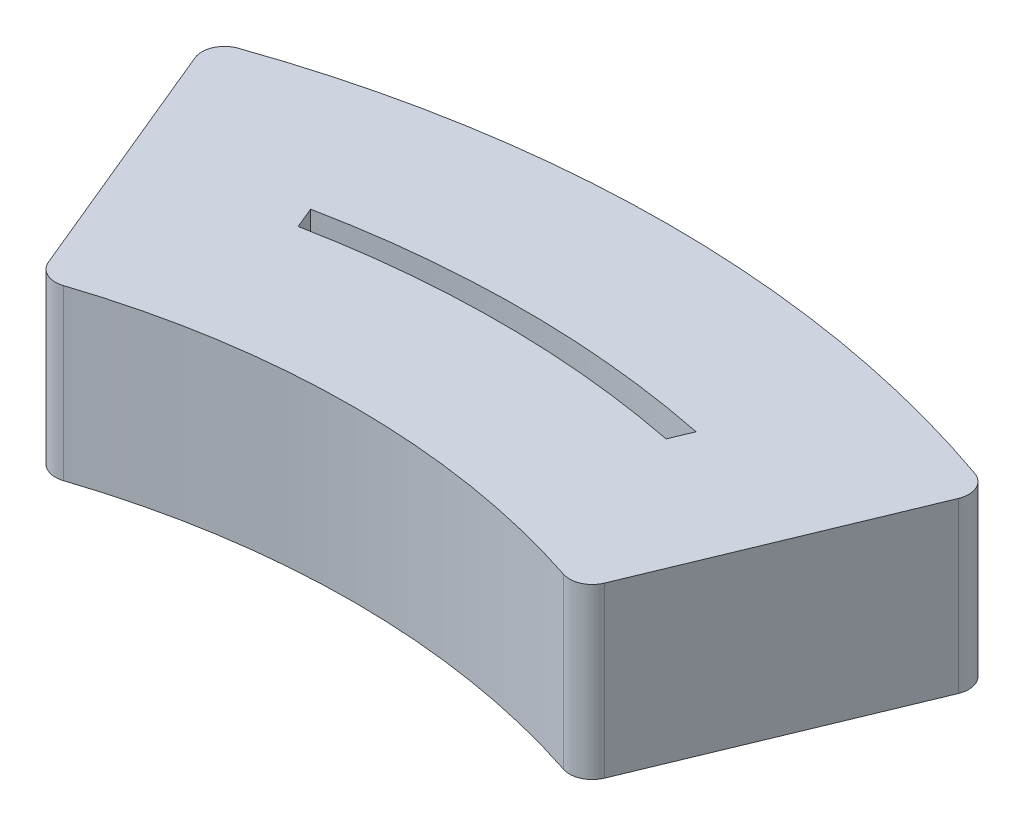
ISO-10303-21;
HEADER;
FILE_DESCRIPTION(('STEP AP214'),'2;1');
FILE_NAME('part.step','',(''),(''),'','','');
FILE_SCHEMA(('AUTOMOTIVE_DESIGN { 1 0 10303 214 1 1 1 1 }'));
ENDSEC;
DATA;
#1=APPLICATION_CONTEXT('core data for automotive mechanical design processes');
#2=APPLICATION_PROTOCOL_DEFINITION('international standard','automotive_design',2000,#1);
#3=PRODUCT_CONTEXT('',#1,'mechanical');
#4=PRODUCT('Part','Part','',(#3));
#5=PRODUCT_RELATED_PRODUCT_CATEGORY('part','',(#4));
#6=PRODUCT_DEFINITION_FORMATION('','',#4);
#7=PRODUCT_DEFINITION_CONTEXT('part definition',#1,'design');
#8=PRODUCT_DEFINITION('design','',#6,#7);
#9=PRODUCT_DEFINITION_SHAPE('','',#8);
#10=(LENGTH_UNIT() NAMED_UNIT(*) SI_UNIT(.MILLI.,.METRE.));
#11=(NAMED_UNIT(*) PLANE_ANGLE_UNIT() SI_UNIT($,.RADIAN.));
#12=(NAMED_UNIT(*) SI_UNIT($,.STERADIAN.) SOLID_ANGLE_UNIT());
#13=UNCERTAINTY_MEASURE_WITH_UNIT(LENGTH_MEASURE(1.E-05),#10,'distance_accuracy_value','');
#14=(GEOMETRIC_REPRESENTATION_CONTEXT(3) GLOBAL_UNCERTAINTY_ASSIGNED_CONTEXT((#13)) GLOBAL_UNIT_ASSIGNED_CONTEXT((#10,
#11,#12)) REPRESENTATION_CONTEXT('',''));
#15=CARTESIAN_POINT('',(0.,0.,0.));
#16=DIRECTION('',(0.,0.,1.));
#17=DIRECTION('',(1.,0.,0.));
#18=AXIS2_PLACEMENT_3D('',#15,#16,#17);
#19=CARTESIAN_POINT('',(160.369594431657,37.5,-44.0759031903086));
#20=DIRECTION('',(0.,-1.,0.));
#21=DIRECTION('',(0.,0.,-1.));
#22=AXIS2_PLACEMENT_3D('',#19,#20,#21);
#23=PLANE('',#22);
#24=CARTESIAN_POINT('',(160.369594431657,37.5,-44.0759031903086));
#25=DIRECTION('',(0.,1.,0.));
#26=DIRECTION('',(0.,0.,-1.));
#27=AXIS2_PLACEMENT_3D('',#24,#25,#26);
#28=CIRCLE('',#27,10.);
#29=CARTESIAN_POINT('',(169.60838975677,37.5,-40.2490688666577));
#30=VERTEX_POINT('',#29);
#31=CARTESIAN_POINT('',(163.671991071137,37.5,-53.5148743437529));
#32=VERTEX_POINT('',#31);
#33=EDGE_CURVE('E158',#30,#32,#28,.T.);
#34=ORIENTED_EDGE('',*,*,#33,.T.);
#35=CARTESIAN_POINT('',(0.203357416899197,37.5,413.714197751741));
#36=DIRECTION('',(0.,1.,0.));
#37=DIRECTION('',(0.,0.,1.));
#38=AXIS2_PLACEMENT_3D('',#35,#36,#37);
#39=CIRCLE('',#38,495.);
#40=CARTESIAN_POINT('',(-163.265276237338,37.5,-53.5148743437529));
#41=VERTEX_POINT('',#40);
#42=EDGE_CURVE('E161',#32,#41,#39,.T.);
#43=ORIENTED_EDGE('',*,*,#42,.T.);
#44=CARTESIAN_POINT('',(-159.962879597859,37.5,-44.0759031903086));
#45=DIRECTION('',(0.,1.,0.));
#46=DIRECTION('',(0.,0.,-1.));
#47=AXIS2_PLACEMENT_3D('',#44,#45,#46);
#48=CIRCLE('',#47,10.);
#49=CARTESIAN_POINT('',(-169.201674922972,37.5,-40.2490688666577));
#50=VERTEX_POINT('',#49);
#51=EDGE_CURVE('E164',#41,#50,#48,.T.);
#52=ORIENTED_EDGE('',*,*,#51,.T.);
#53=DIRECTION('',(0.382683432365087,0.,0.923879532511288));
#54=VECTOR('',#53,1.);
#55=CARTESIAN_POINT('',(-169.201674922972,37.5,-40.2490688666577));
#56=LINE('',#55,#54);
#57=CARTESIAN_POINT('',(-123.183289960131,37.5,70.8491402291399));
#58=VERTEX_POINT('',#57);
#59=EDGE_CURVE('E166',#50,#58,#56,.T.);
#60=ORIENTED_EDGE('',*,*,#59,.T.);
#61=CARTESIAN_POINT('',(-113.944494635018,37.5,67.022305905489));
#62=DIRECTION('',(0.,1.,0.));
#63=DIRECTION('',(0.,0.,1.));
#64=AXIS2_PLACEMENT_3D('',#61,#62,#63);
#65=CIRCLE('',#64,10.);
#66=CARTESIAN_POINT('',(-110.817156222636,37.5,76.5207139012768));
#67=VERTEX_POINT('',#66);
#68=EDGE_CURVE('E168',#58,#67,#65,.T.);
#69=ORIENTED_EDGE('',*,*,#68,.T.);
#70=CARTESIAN_POINT('',(0.203357416899197,37.5,413.714197751741));
#71=DIRECTION('',(0.,-1.,0.));
#72=DIRECTION('',(0.,0.,-1.));
#73=AXIS2_PLACEMENT_3D('',#70,#71,#72);
#74=CIRCLE('',#73,355.);
#75=CARTESIAN_POINT('',(111.223871056435,37.5,76.5207139012768));
#76=VERTEX_POINT('',#75);
#77=EDGE_CURVE('E170',#67,#76,#74,.T.);
#78=ORIENTED_EDGE('',*,*,#77,.T.);
#79=CARTESIAN_POINT('',(114.351209468816,37.5,67.022305905489));
#80=DIRECTION('',(0.,1.,0.));
#81=DIRECTION('',(0.,0.,-1.));
#82=AXIS2_PLACEMENT_3D('',#79,#80,#81);
#83=CIRCLE('',#82,10.);
#84=CARTESIAN_POINT('',(123.590004793929,37.5,70.8491402291399));
#85=VERTEX_POINT('',#84);
#86=EDGE_CURVE('E172',#76,#85,#83,.T.);
#87=ORIENTED_EDGE('',*,*,#86,.T.);
#88=DIRECTION('',(0.382683432365087,0.,-0.923879532511288));
#89=VECTOR('',#88,1.);
#90=CARTESIAN_POINT('',(123.590004793929,37.5,70.8491402291399));
#91=LINE('',#90,#89);
#92=EDGE_CURVE('E174',#85,#30,#91,.T.);
#93=ORIENTED_EDGE('',*,*,#92,.T.);
#94=EDGE_LOOP('',(#34,#43,#52,#60,#69,#78,#87,#93));
#95=FACE_BOUND('',#94,.T.);
#96=DIRECTION('',(0.382683432365087,0.,-0.923879532511288));
#97=VECTOR('',#96,1.);
#98=CARTESIAN_POINT('',(81.8648120493621,37.5,1.72948101177539));
#99=LINE('',#98,#97);
#100=CARTESIAN_POINT('',(81.8648120493621,37.5,1.72948101177539));
#101=VERTEX_POINT('',#100);
#102=CARTESIAN_POINT('',(85.7653340171303,37.5,-7.68721202314482));
#103=VERTEX_POINT('',#102);
#104=EDGE_CURVE('E122',#101,#103,#99,.T.);
#105=ORIENTED_EDGE('',*,*,#104,.F.);
#106=CARTESIAN_POINT('',(0.203357416899197,37.5,413.714197751741));
#107=DIRECTION('',(0.,-1.,0.));
#108=DIRECTION('',(0.,0.,-1.));
#109=AXIS2_PLACEMENT_3D('',#106,#107,#108);
#110=CIRCLE('',#109,420.);
#111=CARTESIAN_POINT('',(-81.4580972155637,37.5,1.72948101177539));
#112=VERTEX_POINT('',#111);
#113=EDGE_CURVE('E144',#112,#101,#110,.T.);
#114=ORIENTED_EDGE('',*,*,#113,.F.);
#115=DIRECTION('',(0.382683432365088,0.,0.923879532511288));
#116=VECTOR('',#115,1.);
#117=CARTESIAN_POINT('',(-85.3586191833319,37.5,-7.68721202314482));
#118=LINE('',#117,#116);
#119=CARTESIAN_POINT('',(-85.3586191833318,37.5,-7.68721202314482));
#120=VERTEX_POINT('',#119);
#121=EDGE_CURVE('E142',#120,#112,#118,.T.);
#122=ORIENTED_EDGE('',*,*,#121,.F.);
#123=CARTESIAN_POINT('',(0.203357416899197,37.5,413.714197751741));
#124=DIRECTION('',(0.,1.,0.));
#125=DIRECTION('',(0.,0.,1.));
#126=AXIS2_PLACEMENT_3D('',#123,#124,#125);
#127=CIRCLE('',#126,430.);
#128=EDGE_CURVE('E130',#103,#120,#127,.T.);
#129=ORIENTED_EDGE('',*,*,#128,.F.);
#130=EDGE_LOOP('',(#105,#114,#122,#129));
#131=FACE_BOUND('',#130,.T.);
#132=ADVANCED_FACE('F33',(#95,#131),#23,.F.);
#133=CARTESIAN_POINT('',(160.369594431657,-37.5,-44.0759031903086));
#134=DIRECTION('',(0.,-1.,0.));
#135=DIRECTION('',(0.,0.,-1.));
#136=AXIS2_PLACEMENT_3D('',#133,#134,#135);
#137=PLANE('',#136);
#138=CARTESIAN_POINT('',(160.369594431657,-37.5,-44.0759031903086));
#139=DIRECTION('',(0.,1.,0.));
#140=DIRECTION('',(0.,0.,-1.));
#141=AXIS2_PLACEMENT_3D('',#138,#139,#140);
#142=CIRCLE('',#141,10.);
#143=CARTESIAN_POINT('',(169.60838975677,-37.5,-40.2490688666577));
#144=VERTEX_POINT('',#143);
#145=CARTESIAN_POINT('',(163.671991071137,-37.5,-53.5148743437529));
#146=VERTEX_POINT('',#145);
#147=EDGE_CURVE('E138',#144,#146,#142,.T.);
#148=ORIENTED_EDGE('',*,*,#147,.F.);
#149=DIRECTION('',(0.382683432365087,0.,-0.923879532511288));
#150=VECTOR('',#149,1.);
#151=CARTESIAN_POINT('',(123.590004793929,-37.5,70.8491402291399));
#152=LINE('',#151,#150);
#153=CARTESIAN_POINT('',(123.590004793929,-37.5,70.8491402291399));
#154=VERTEX_POINT('',#153);
#155=EDGE_CURVE('E162',#154,#144,#152,.T.);
#156=ORIENTED_EDGE('',*,*,#155,.F.);
#157=CARTESIAN_POINT('',(114.351209468816,-37.5,67.022305905489));
#158=DIRECTION('',(0.,1.,0.));
#159=DIRECTION('',(0.,0.,-1.));
#160=AXIS2_PLACEMENT_3D('',#157,#158,#159);
#161=CIRCLE('',#160,10.);
#162=CARTESIAN_POINT('',(111.223871056435,-37.5,76.5207139012768));
#163=VERTEX_POINT('',#162);
#164=EDGE_CURVE('E189',#163,#154,#161,.T.);
#165=ORIENTED_EDGE('',*,*,#164,.F.);
#166=CARTESIAN_POINT('',(0.203357416899197,-37.5,413.714197751741));
#167=DIRECTION('',(0.,-1.,0.));
#168=DIRECTION('',(0.,0.,-1.));
#169=AXIS2_PLACEMENT_3D('',#166,#167,#168);
#170=CIRCLE('',#169,355.);
#171=CARTESIAN_POINT('',(-110.817156222636,-37.5,76.5207139012768));
#172=VERTEX_POINT('',#171);
#173=EDGE_CURVE('E187',#172,#163,#170,.T.);
#174=ORIENTED_EDGE('',*,*,#173,.F.);
#175=CARTESIAN_POINT('',(-113.944494635018,-37.5,67.022305905489));
#176=DIRECTION('',(0.,1.,0.));
#177=DIRECTION('',(0.,0.,1.));
#178=AXIS2_PLACEMENT_3D('',#175,#176,#177);
#179=CIRCLE('',#178,10.);
#180=CARTESIAN_POINT('',(-123.183289960131,-37.5,70.8491402291399));
#181=VERTEX_POINT('',#180);
#182=EDGE_CURVE('E185',#181,#172,#179,.T.);
#183=ORIENTED_EDGE('',*,*,#182,.F.);
#184=DIRECTION('',(0.382683432365087,0.,0.923879532511288));
#185=VECTOR('',#184,1.);
#186=CARTESIAN_POINT('',(-169.201674922972,-37.5,-40.2490688666577));
#187=LINE('',#186,#185);
#188=CARTESIAN_POINT('',(-169.201674922972,-37.5,-40.2490688666577));
#189=VERTEX_POINT('',#188);
#190=EDGE_CURVE('E183',#189,#181,#187,.T.);
#191=ORIENTED_EDGE('',*,*,#190,.F.);
#192=CARTESIAN_POINT('',(-159.962879597859,-37.5,-44.0759031903086));
#193=DIRECTION('',(0.,1.,0.));
#194=DIRECTION('',(0.,0.,-1.));
#195=AXIS2_PLACEMENT_3D('',#192,#193,#194);
#196=CIRCLE('',#195,10.);
#197=CARTESIAN_POINT('',(-163.265276237338,-37.5,-53.5148743437529));
#198=VERTEX_POINT('',#197);
#199=EDGE_CURVE('E181',#198,#189,#196,.T.);
#200=ORIENTED_EDGE('',*,*,#199,.F.);
#201=CARTESIAN_POINT('',(0.203357416899197,-37.5,413.714197751741));
#202=DIRECTION('',(0.,1.,0.));
#203=DIRECTION('',(0.,0.,1.));
#204=AXIS2_PLACEMENT_3D('',#201,#202,#203);
#205=CIRCLE('',#204,495.);
#206=EDGE_CURVE('E179',#146,#198,#205,.T.);
#207=ORIENTED_EDGE('',*,*,#206,.F.);
#208=EDGE_LOOP('',(#148,#156,#165,#174,#183,#191,#200,#207));
#209=FACE_BOUND('',#208,.T.);
#210=CARTESIAN_POINT('',(0.203357416899197,-37.5,413.714197751741));
#211=DIRECTION('',(0.,-1.,0.));
#212=DIRECTION('',(0.,0.,-1.));
#213=AXIS2_PLACEMENT_3D('',#210,#211,#212);
#214=CIRCLE('',#213,420.);
#215=CARTESIAN_POINT('',(-81.4580972155637,-37.5,1.72948101177539));
#216=VERTEX_POINT('',#215);
#217=CARTESIAN_POINT('',(81.8648120493621,-37.5,1.72948101177539));
#218=VERTEX_POINT('',#217);
#219=EDGE_CURVE('E131',#216,#218,#214,.T.);
#220=ORIENTED_EDGE('',*,*,#219,.T.);
#221=DIRECTION('',(0.382683432365087,0.,-0.923879532511288));
#222=VECTOR('',#221,1.);
#223=CARTESIAN_POINT('',(81.8648120493621,-37.5,1.72948101177539));
#224=LINE('',#223,#222);
#225=CARTESIAN_POINT('',(85.7653340171303,-37.5,-7.68721202314482));
#226=VERTEX_POINT('',#225);
#227=EDGE_CURVE('E56',#218,#226,#224,.T.);
#228=ORIENTED_EDGE('',*,*,#227,.T.);
#229=CARTESIAN_POINT('',(0.203357416899197,-37.5,413.714197751741));
#230=DIRECTION('',(0.,1.,0.));
#231=DIRECTION('',(0.,0.,1.));
#232=AXIS2_PLACEMENT_3D('',#229,#230,#231);
#233=CIRCLE('',#232,430.);
#234=CARTESIAN_POINT('',(-85.3586191833318,-37.5,-7.68721202314482));
#235=VERTEX_POINT('',#234);
#236=EDGE_CURVE('E137',#226,#235,#233,.T.);
#237=ORIENTED_EDGE('',*,*,#236,.T.);
#238=DIRECTION('',(0.382683432365088,0.,0.923879532511288));
#239=VECTOR('',#238,1.);
#240=CARTESIAN_POINT('',(-85.3586191833319,-37.5,-7.68721202314482));
#241=LINE('',#240,#239);
#242=EDGE_CURVE('E150',#235,#216,#241,.T.);
#243=ORIENTED_EDGE('',*,*,#242,.T.);
#244=EDGE_LOOP('',(#220,#228,#237,#243));
#245=FACE_BOUND('',#244,.T.);
#246=ADVANCED_FACE('F219',(#209,#245),#137,.T.);
#247=CARTESIAN_POINT('',(160.369594431657,37.5,-44.0759031903086));
#248=DIRECTION('',(0.,-1.,0.));
#249=DIRECTION('',(0.,0.,-1.));
#250=AXIS2_PLACEMENT_3D('',#247,#248,#249);
#251=CYLINDRICAL_SURFACE('',#250,10.);
#252=ORIENTED_EDGE('',*,*,#147,.T.);
#253=DIRECTION('',(0.,-1.,0.));
#254=VECTOR('',#253,1.);
#255=CARTESIAN_POINT('',(163.671991071137,37.5,-53.5148743437529));
#256=LINE('',#255,#254);
#257=EDGE_CURVE('E11',#32,#146,#256,.T.);
#258=ORIENTED_EDGE('',*,*,#257,.F.);
#259=ORIENTED_EDGE('',*,*,#33,.F.);
#260=DIRECTION('',(0.,-1.,0.));
#261=VECTOR('',#260,1.);
#262=CARTESIAN_POINT('',(169.60838975677,37.5,-40.2490688666577));
#263=LINE('',#262,#261);
#264=EDGE_CURVE('E176',#30,#144,#263,.T.);
#265=ORIENTED_EDGE('',*,*,#264,.T.);
#266=EDGE_LOOP('',(#252,#258,#259,#265));
#267=FACE_BOUND('',#266,.T.);
#268=ADVANCED_FACE('F35',(#267),#251,.T.);
#269=CARTESIAN_POINT('',(0.203357416899197,37.5,413.714197751741));
#270=DIRECTION('',(0.,-1.,0.));
#271=DIRECTION('',(0.,0.,-1.));
#272=AXIS2_PLACEMENT_3D('',#269,#270,#271);
#273=CYLINDRICAL_SURFACE('',#272,495.);
#274=ORIENTED_EDGE('',*,*,#206,.T.);
#275=DIRECTION('',(0.,-1.,0.));
#276=VECTOR('',#275,1.);
#277=CARTESIAN_POINT('',(-163.265276237338,37.5,-53.5148743437529));
#278=LINE('',#277,#276);
#279=EDGE_CURVE('E41',#41,#198,#278,.T.);
#280=ORIENTED_EDGE('',*,*,#279,.F.);
#281=ORIENTED_EDGE('',*,*,#42,.F.);
#282=ORIENTED_EDGE('',*,*,#257,.T.);
#283=EDGE_LOOP('',(#274,#280,#281,#282));
#284=FACE_BOUND('',#283,.T.);
#285=ADVANCED_FACE('F236',(#284),#273,.T.);
#286=CARTESIAN_POINT('',(-159.962879597859,37.5,-44.0759031903086));
#287=DIRECTION('',(0.,-1.,0.));
#288=DIRECTION('',(0.,0.,-1.));
#289=AXIS2_PLACEMENT_3D('',#286,#287,#288);
#290=CYLINDRICAL_SURFACE('',#289,10.);
#291=ORIENTED_EDGE('',*,*,#199,.T.);
#292=DIRECTION('',(0.,-1.,0.));
#293=VECTOR('',#292,1.);
#294=CARTESIAN_POINT('',(-169.201674922972,37.5,-40.2490688666577));
#295=LINE('',#294,#293);
#296=EDGE_CURVE('E206',#50,#189,#295,.T.);
#297=ORIENTED_EDGE('',*,*,#296,.F.);
#298=ORIENTED_EDGE('',*,*,#51,.F.);
#299=ORIENTED_EDGE('',*,*,#279,.T.);
#300=EDGE_LOOP('',(#291,#297,#298,#299));
#301=FACE_BOUND('',#300,.T.);
#302=ADVANCED_FACE('F213',(#301),#290,.T.);
#303=CARTESIAN_POINT('',(-169.201674922972,37.5,-40.2490688666577));
#304=DIRECTION('',(0.923879532511288,0.,-0.382683432365087));
#305=DIRECTION('',(-0.382683432365087,0.,-0.923879532511288));
#306=AXIS2_PLACEMENT_3D('',#303,#304,#305);
#307=PLANE('',#306);
#308=ORIENTED_EDGE('',*,*,#190,.T.);
#309=DIRECTION('',(0.,-1.,0.));
#310=VECTOR('',#309,1.);
#311=CARTESIAN_POINT('',(-123.183289960131,37.5,70.8491402291399));
#312=LINE('',#311,#310);
#313=EDGE_CURVE('E203',#58,#181,#312,.T.);
#314=ORIENTED_EDGE('',*,*,#313,.F.);
#315=ORIENTED_EDGE('',*,*,#59,.F.);
#316=ORIENTED_EDGE('',*,*,#296,.T.);
#317=EDGE_LOOP('',(#308,#314,#315,#316));
#318=FACE_BOUND('',#317,.T.);
#319=ADVANCED_FACE('F225',(#318),#307,.F.);
#320=CARTESIAN_POINT('',(-113.944494635018,37.5,67.022305905489));
#321=DIRECTION('',(0.,-1.,0.));
#322=DIRECTION('',(0.,0.,-1.));
#323=AXIS2_PLACEMENT_3D('',#320,#321,#322);
#324=CYLINDRICAL_SURFACE('',#323,10.);
#325=ORIENTED_EDGE('',*,*,#182,.T.);
#326=DIRECTION('',(0.,-1.,0.));
#327=VECTOR('',#326,1.);
#328=CARTESIAN_POINT('',(-110.817156222636,37.5,76.5207139012768));
#329=LINE('',#328,#327);
#330=EDGE_CURVE('E200',#67,#172,#329,.T.);
#331=ORIENTED_EDGE('',*,*,#330,.F.);
#332=ORIENTED_EDGE('',*,*,#68,.F.);
#333=ORIENTED_EDGE('',*,*,#313,.T.);
#334=EDGE_LOOP('',(#325,#331,#332,#333));
#335=FACE_BOUND('',#334,.T.);
#336=ADVANCED_FACE('F229',(#335),#324,.T.);
#337=CARTESIAN_POINT('',(0.203357416899197,37.5,413.714197751741));
#338=DIRECTION('',(0.,-1.,0.));
#339=DIRECTION('',(0.,0.,-1.));
#340=AXIS2_PLACEMENT_3D('',#337,#338,#339);
#341=CYLINDRICAL_SURFACE('',#340,355.);
#342=ORIENTED_EDGE('',*,*,#173,.T.);
#343=DIRECTION('',(0.,-1.,0.));
#344=VECTOR('',#343,1.);
#345=CARTESIAN_POINT('',(111.223871056435,37.5,76.5207139012768));
#346=LINE('',#345,#344);
#347=EDGE_CURVE('E197',#76,#163,#346,.T.);
#348=ORIENTED_EDGE('',*,*,#347,.F.);
#349=ORIENTED_EDGE('',*,*,#77,.F.);
#350=ORIENTED_EDGE('',*,*,#330,.T.);
#351=EDGE_LOOP('',(#342,#348,#349,#350));
#352=FACE_BOUND('',#351,.T.);
#353=ADVANCED_FACE('F249',(#352),#341,.F.);
#354=CARTESIAN_POINT('',(114.351209468816,37.5,67.022305905489));
#355=DIRECTION('',(0.,-1.,0.));
#356=DIRECTION('',(0.,0.,-1.));
#357=AXIS2_PLACEMENT_3D('',#354,#355,#356);
#358=CYLINDRICAL_SURFACE('',#357,10.);
#359=ORIENTED_EDGE('',*,*,#164,.T.);
#360=DIRECTION('',(0.,-1.,0.));
#361=VECTOR('',#360,1.);
#362=CARTESIAN_POINT('',(123.590004793929,37.5,70.8491402291399));
#363=LINE('',#362,#361);
#364=EDGE_CURVE('E194',#85,#154,#363,.T.);
#365=ORIENTED_EDGE('',*,*,#364,.F.);
#366=ORIENTED_EDGE('',*,*,#86,.F.);
#367=ORIENTED_EDGE('',*,*,#347,.T.);
#368=EDGE_LOOP('',(#359,#365,#366,#367));
#369=FACE_BOUND('',#368,.T.);
#370=ADVANCED_FACE('F247',(#369),#358,.T.);
#371=CARTESIAN_POINT('',(123.590004793929,37.5,70.8491402291399));
#372=DIRECTION('',(-0.923879532511288,0.,-0.382683432365087));
#373=DIRECTION('',(-0.382683432365087,0.,0.923879532511288));
#374=AXIS2_PLACEMENT_3D('',#371,#372,#373);
#375=PLANE('',#374);
#376=ORIENTED_EDGE('',*,*,#155,.T.);
#377=ORIENTED_EDGE('',*,*,#264,.F.);
#378=ORIENTED_EDGE('',*,*,#92,.F.);
#379=ORIENTED_EDGE('',*,*,#364,.T.);
#380=EDGE_LOOP('',(#376,#377,#378,#379));
#381=FACE_BOUND('',#380,.T.);
#382=ADVANCED_FACE('F242',(#381),#375,.F.);
#383=CARTESIAN_POINT('',(81.8648120493621,37.5,1.72948101177539));
#384=DIRECTION('',(-0.923879532511288,0.,-0.382683432365087));
#385=DIRECTION('',(-0.382683432365088,0.,0.923879532511288));
#386=AXIS2_PLACEMENT_3D('',#383,#384,#385);
#387=PLANE('',#386);
#388=ORIENTED_EDGE('',*,*,#227,.F.);
#389=DIRECTION('',(0.,-1.,0.));
#390=VECTOR('',#389,1.);
#391=CARTESIAN_POINT('',(81.8648120493621,37.5,1.72948101177539));
#392=LINE('',#391,#390);
#393=EDGE_CURVE('E126',#101,#218,#392,.T.);
#394=ORIENTED_EDGE('',*,*,#393,.F.);
#395=ORIENTED_EDGE('',*,*,#104,.T.);
#396=DIRECTION('',(0.,-1.,0.));
#397=VECTOR('',#396,1.);
#398=CARTESIAN_POINT('',(85.7653340171303,37.5,-7.68721202314482));
#399=LINE('',#398,#397);
#400=EDGE_CURVE('E125',#103,#226,#399,.T.);
#401=ORIENTED_EDGE('',*,*,#400,.T.);
#402=EDGE_LOOP('',(#388,#394,#395,#401));
#403=FACE_BOUND('',#402,.T.);
#404=ADVANCED_FACE('F124',(#403),#387,.T.);
#405=CARTESIAN_POINT('',(0.203357416899197,37.5,413.714197751741));
#406=DIRECTION('',(0.,-1.,0.));
#407=DIRECTION('',(0.,0.,-1.));
#408=AXIS2_PLACEMENT_3D('',#405,#406,#407);
#409=CYLINDRICAL_SURFACE('',#408,430.);
#410=ORIENTED_EDGE('',*,*,#236,.F.);
#411=ORIENTED_EDGE('',*,*,#400,.F.);
#412=ORIENTED_EDGE('',*,*,#128,.T.);
#413=DIRECTION('',(0.,-1.,0.));
#414=VECTOR('',#413,1.);
#415=CARTESIAN_POINT('',(-85.3586191833318,37.5,-7.68721202314482));
#416=LINE('',#415,#414);
#417=EDGE_CURVE('E139',#120,#235,#416,.T.);
#418=ORIENTED_EDGE('',*,*,#417,.T.);
#419=EDGE_LOOP('',(#410,#411,#412,#418));
#420=FACE_BOUND('',#419,.T.);
#421=ADVANCED_FACE('F134',(#420),#409,.F.);
#422=CARTESIAN_POINT('',(-85.3586191833319,37.5,-7.68721202314482));
#423=DIRECTION('',(0.923879532511288,0.,-0.382683432365088));
#424=DIRECTION('',(-0.382683432365088,0.,-0.923879532511288));
#425=AXIS2_PLACEMENT_3D('',#422,#423,#424);
#426=PLANE('',#425);
#427=ORIENTED_EDGE('',*,*,#242,.F.);
#428=ORIENTED_EDGE('',*,*,#417,.F.);
#429=ORIENTED_EDGE('',*,*,#121,.T.);
#430=DIRECTION('',(0.,-1.,0.));
#431=VECTOR('',#430,1.);
#432=CARTESIAN_POINT('',(-81.4580972155637,37.5,1.72948101177539));
#433=LINE('',#432,#431);
#434=EDGE_CURVE('E48',#112,#216,#433,.T.);
#435=ORIENTED_EDGE('',*,*,#434,.T.);
#436=EDGE_LOOP('',(#427,#428,#429,#435));
#437=FACE_BOUND('',#436,.T.);
#438=ADVANCED_FACE('F274',(#437),#426,.T.);
#439=CARTESIAN_POINT('',(0.203357416899197,37.5,413.714197751741));
#440=DIRECTION('',(0.,-1.,0.));
#441=DIRECTION('',(0.,0.,-1.));
#442=AXIS2_PLACEMENT_3D('',#439,#440,#441);
#443=CYLINDRICAL_SURFACE('',#442,420.);
#444=ORIENTED_EDGE('',*,*,#219,.F.);
#445=ORIENTED_EDGE('',*,*,#434,.F.);
#446=ORIENTED_EDGE('',*,*,#113,.T.);
#447=ORIENTED_EDGE('',*,*,#393,.T.);
#448=EDGE_LOOP('',(#444,#445,#446,#447));
#449=FACE_BOUND('',#448,.T.);
#450=ADVANCED_FACE('F278',(#449),#443,.T.);
#451=CLOSED_SHELL('',(#132,#246,#268,#285,#302,#319,#336,#353,#370,#382,#404,#421,#438,#450));
#452=MANIFOLD_SOLID_BREP('B2',#451);
#453=ADVANCED_BREP_SHAPE_REPRESENTATION('',(#18,#452),#14);
#454=SHAPE_DEFINITION_REPRESENTATION(#9,#453);
ENDSEC;
END-ISO-10303-21;
